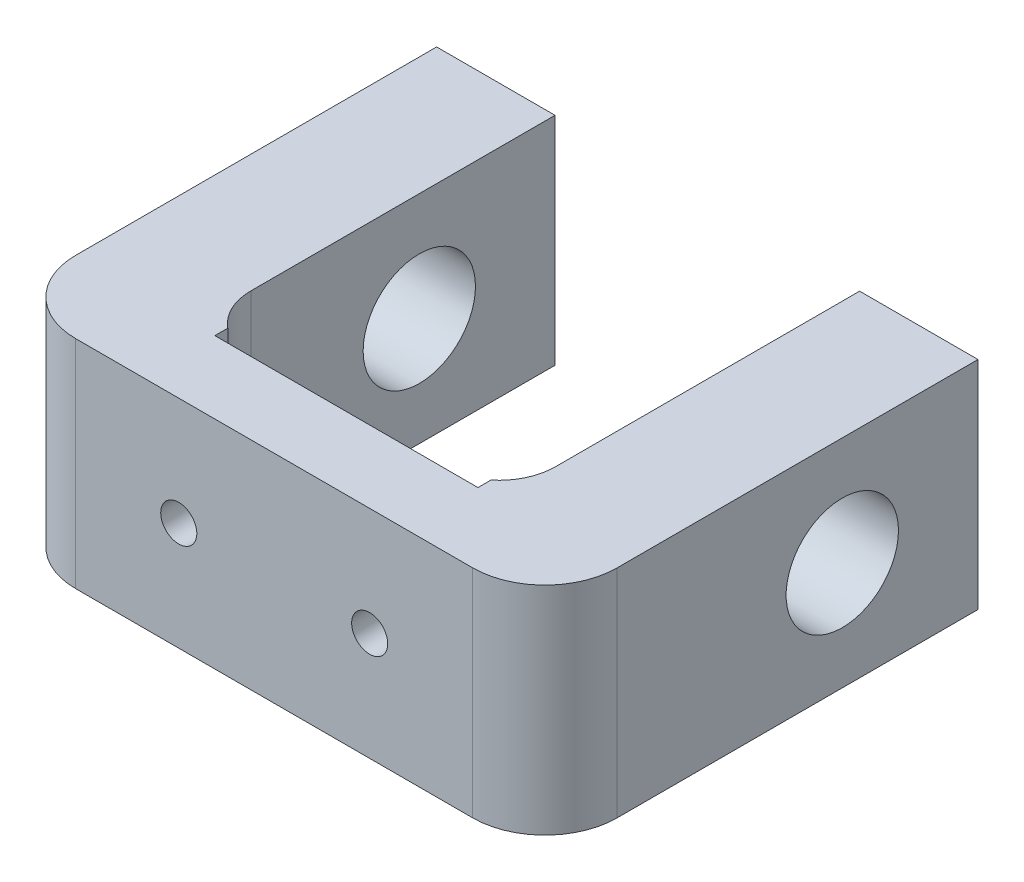
ISO-10303-21;
HEADER;
FILE_DESCRIPTION(('STEP AP214'),'2;1');
FILE_NAME('part.step','',(''),(''),'','','');
FILE_SCHEMA(('AUTOMOTIVE_DESIGN { 1 0 10303 214 1 1 1 1 }'));
ENDSEC;
DATA;
#1=APPLICATION_CONTEXT('core data for automotive mechanical design processes');
#2=APPLICATION_PROTOCOL_DEFINITION('international standard','automotive_design',2000,#1);
#3=PRODUCT_CONTEXT('',#1,'mechanical');
#4=PRODUCT('Part','Part','',(#3));
#5=PRODUCT_RELATED_PRODUCT_CATEGORY('part','',(#4));
#6=PRODUCT_DEFINITION_FORMATION('','',#4);
#7=PRODUCT_DEFINITION_CONTEXT('part definition',#1,'design');
#8=PRODUCT_DEFINITION('design','',#6,#7);
#9=PRODUCT_DEFINITION_SHAPE('','',#8);
#10=(LENGTH_UNIT() NAMED_UNIT(*) SI_UNIT(.MILLI.,.METRE.));
#11=(NAMED_UNIT(*) PLANE_ANGLE_UNIT() SI_UNIT($,.RADIAN.));
#12=(NAMED_UNIT(*) SI_UNIT($,.STERADIAN.) SOLID_ANGLE_UNIT());
#13=UNCERTAINTY_MEASURE_WITH_UNIT(LENGTH_MEASURE(1.E-05),#10,'distance_accuracy_value','');
#14=(GEOMETRIC_REPRESENTATION_CONTEXT(3) GLOBAL_UNCERTAINTY_ASSIGNED_CONTEXT((#13)) GLOBAL_UNIT_ASSIGNED_CONTEXT((#10,
#11,#12)) REPRESENTATION_CONTEXT('',''));
#15=CARTESIAN_POINT('',(0.,0.,0.));
#16=DIRECTION('',(0.,0.,1.));
#17=DIRECTION('',(1.,0.,0.));
#18=AXIS2_PLACEMENT_3D('',#15,#16,#17);
#19=CARTESIAN_POINT('',(-47.625,38.1,-76.2));
#20=DIRECTION('',(0.,0.,1.));
#21=DIRECTION('',(1.,0.,0.));
#22=AXIS2_PLACEMENT_3D('',#19,#20,#21);
#23=PLANE('',#22);
#24=DIRECTION('',(-1.,0.,0.));
#25=VECTOR('',#24,1.);
#26=CARTESIAN_POINT('',(-47.625,0.,-76.2));
#27=LINE('',#26,#25);
#28=CARTESIAN_POINT('',(-26.797,0.,-76.2));
#29=VERTEX_POINT('',#28);
#30=CARTESIAN_POINT('',(-47.625,0.,-76.2));
#31=VERTEX_POINT('',#30);
#32=EDGE_CURVE('E159',#29,#31,#27,.T.);
#33=ORIENTED_EDGE('',*,*,#32,.T.);
#34=DIRECTION('',(0.,-1.,0.));
#35=VECTOR('',#34,1.);
#36=CARTESIAN_POINT('',(-47.625,38.1,-76.2));
#37=LINE('',#36,#35);
#38=CARTESIAN_POINT('',(-47.625,38.1,-76.2));
#39=VERTEX_POINT('',#38);
#40=EDGE_CURVE('E202',#39,#31,#37,.T.);
#41=ORIENTED_EDGE('',*,*,#40,.F.);
#42=DIRECTION('',(-1.,0.,0.));
#43=VECTOR('',#42,1.);
#44=CARTESIAN_POINT('',(-47.625,38.1,-76.2));
#45=LINE('',#44,#43);
#46=CARTESIAN_POINT('',(-26.797,38.1,-76.2));
#47=VERTEX_POINT('',#46);
#48=EDGE_CURVE('E183',#47,#39,#45,.T.);
#49=ORIENTED_EDGE('',*,*,#48,.F.);
#50=DIRECTION('',(0.,-1.,0.));
#51=VECTOR('',#50,1.);
#52=CARTESIAN_POINT('',(-26.797,38.1,-76.2));
#53=LINE('',#52,#51);
#54=EDGE_CURVE('E158',#47,#29,#53,.T.);
#55=ORIENTED_EDGE('',*,*,#54,.T.);
#56=EDGE_LOOP('',(#33,#41,#49,#55));
#57=FACE_BOUND('',#56,.T.);
#58=ADVANCED_FACE('F33',(#57),#23,.F.);
#59=CARTESIAN_POINT('',(-47.625,38.1,-76.2));
#60=DIRECTION('',(1.,0.,0.));
#61=DIRECTION('',(0.,0.,-1.));
#62=AXIS2_PLACEMENT_3D('',#59,#60,#61);
#63=PLANE('',#62);
#64=CARTESIAN_POINT('',(-47.625,19.05,-52.324));
#65=DIRECTION('',(1.,0.,0.));
#66=DIRECTION('',(0.,0.,-1.));
#67=AXIS2_PLACEMENT_3D('',#64,#65,#66);
#68=CIRCLE('',#67,9.8806);
#69=CARTESIAN_POINT('',(-47.625,19.05,-62.2046));
#70=VERTEX_POINT('',#69);
#71=EDGE_CURVE('E206',#70,#70,#68,.T.);
#72=ORIENTED_EDGE('',*,*,#71,.T.);
#73=EDGE_LOOP('',(#72));
#74=FACE_BOUND('',#73,.T.);
#75=DIRECTION('',(0.,0.,1.));
#76=VECTOR('',#75,1.);
#77=CARTESIAN_POINT('',(-47.625,0.,-76.2));
#78=LINE('',#77,#76);
#79=CARTESIAN_POINT('',(-47.625,0.,-12.7));
#80=VERTEX_POINT('',#79);
#81=EDGE_CURVE('E162',#31,#80,#78,.T.);
#82=ORIENTED_EDGE('',*,*,#81,.T.);
#83=DIRECTION('',(0.,-1.,0.));
#84=VECTOR('',#83,1.);
#85=CARTESIAN_POINT('',(-47.625,38.1,-12.7));
#86=LINE('',#85,#84);
#87=CARTESIAN_POINT('',(-47.625,38.1,-12.7));
#88=VERTEX_POINT('',#87);
#89=EDGE_CURVE('E199',#88,#80,#86,.T.);
#90=ORIENTED_EDGE('',*,*,#89,.F.);
#91=DIRECTION('',(0.,0.,1.));
#92=VECTOR('',#91,1.);
#93=CARTESIAN_POINT('',(-47.625,38.1,-76.2));
#94=LINE('',#93,#92);
#95=EDGE_CURVE('E100',#39,#88,#94,.T.);
#96=ORIENTED_EDGE('',*,*,#95,.F.);
#97=ORIENTED_EDGE('',*,*,#40,.T.);
#98=EDGE_LOOP('',(#82,#90,#96,#97));
#99=FACE_BOUND('',#98,.T.);
#100=ADVANCED_FACE('F231',(#74,#99),#63,.F.);
#101=CARTESIAN_POINT('',(-34.925,38.1,-12.7));
#102=DIRECTION('',(0.,-1.,0.));
#103=DIRECTION('',(0.,0.,-1.));
#104=AXIS2_PLACEMENT_3D('',#101,#102,#103);
#105=CYLINDRICAL_SURFACE('',#104,12.7);
#106=CARTESIAN_POINT('',(-34.925,0.,-12.7));
#107=DIRECTION('',(0.,1.,0.));
#108=DIRECTION('',(0.,0.,-1.));
#109=AXIS2_PLACEMENT_3D('',#106,#107,#108);
#110=CIRCLE('',#109,12.7);
#111=CARTESIAN_POINT('',(-34.925,0.,0.));
#112=VERTEX_POINT('',#111);
#113=EDGE_CURVE('E165',#80,#112,#110,.T.);
#114=ORIENTED_EDGE('',*,*,#113,.T.);
#115=DIRECTION('',(0.,-1.,0.));
#116=VECTOR('',#115,1.);
#117=CARTESIAN_POINT('',(-34.925,38.1,0.));
#118=LINE('',#117,#116);
#119=CARTESIAN_POINT('',(-34.925,38.1,0.));
#120=VERTEX_POINT('',#119);
#121=EDGE_CURVE('E196',#120,#112,#118,.T.);
#122=ORIENTED_EDGE('',*,*,#121,.F.);
#123=CARTESIAN_POINT('',(-34.925,38.1,-12.7));
#124=DIRECTION('',(0.,1.,0.));
#125=DIRECTION('',(0.,0.,-1.));
#126=AXIS2_PLACEMENT_3D('',#123,#124,#125);
#127=CIRCLE('',#126,12.7);
#128=EDGE_CURVE('E249',#88,#120,#127,.T.);
#129=ORIENTED_EDGE('',*,*,#128,.F.);
#130=ORIENTED_EDGE('',*,*,#89,.T.);
#131=EDGE_LOOP('',(#114,#122,#129,#130));
#132=FACE_BOUND('',#131,.T.);
#133=ADVANCED_FACE('F236',(#132),#105,.T.);
#134=CARTESIAN_POINT('',(-34.925,38.1,0.));
#135=DIRECTION('',(0.,0.,-1.));
#136=DIRECTION('',(-1.,0.,0.));
#137=AXIS2_PLACEMENT_3D('',#134,#135,#136);
#138=PLANE('',#137);
#139=CARTESIAN_POINT('',(16.797,19.05,0.));
#140=DIRECTION('',(0.,0.,-1.));
#141=DIRECTION('',(-1.,0.,0.));
#142=AXIS2_PLACEMENT_3D('',#139,#140,#141);
#143=CIRCLE('',#142,3.175);
#144=CARTESIAN_POINT('',(13.622,19.05,0.));
#145=VERTEX_POINT('',#144);
#146=EDGE_CURVE('E310',#145,#145,#143,.T.);
#147=ORIENTED_EDGE('',*,*,#146,.T.);
#148=EDGE_LOOP('',(#147));
#149=FACE_BOUND('',#148,.T.);
#150=CARTESIAN_POINT('',(-16.797,19.05,0.));
#151=DIRECTION('',(0.,0.,-1.));
#152=DIRECTION('',(-1.,0.,0.));
#153=AXIS2_PLACEMENT_3D('',#150,#151,#152);
#154=CIRCLE('',#153,3.175);
#155=CARTESIAN_POINT('',(-19.972,19.05,0.));
#156=VERTEX_POINT('',#155);
#157=EDGE_CURVE('E309',#156,#156,#154,.T.);
#158=ORIENTED_EDGE('',*,*,#157,.T.);
#159=EDGE_LOOP('',(#158));
#160=FACE_BOUND('',#159,.T.);
#161=DIRECTION('',(1.,0.,0.));
#162=VECTOR('',#161,1.);
#163=CARTESIAN_POINT('',(-34.925,0.,0.));
#164=LINE('',#163,#162);
#165=CARTESIAN_POINT('',(34.925,0.,0.));
#166=VERTEX_POINT('',#165);
#167=EDGE_CURVE('E167',#112,#166,#164,.T.);
#168=ORIENTED_EDGE('',*,*,#167,.T.);
#169=DIRECTION('',(0.,-1.,0.));
#170=VECTOR('',#169,1.);
#171=CARTESIAN_POINT('',(34.925,38.1,0.));
#172=LINE('',#171,#170);
#173=CARTESIAN_POINT('',(34.925,38.1,0.));
#174=VERTEX_POINT('',#173);
#175=EDGE_CURVE('E193',#174,#166,#172,.T.);
#176=ORIENTED_EDGE('',*,*,#175,.F.);
#177=DIRECTION('',(1.,0.,0.));
#178=VECTOR('',#177,1.);
#179=CARTESIAN_POINT('',(-34.925,38.1,0.));
#180=LINE('',#179,#178);
#181=EDGE_CURVE('E251',#120,#174,#180,.T.);
#182=ORIENTED_EDGE('',*,*,#181,.F.);
#183=ORIENTED_EDGE('',*,*,#121,.T.);
#184=EDGE_LOOP('',(#168,#176,#182,#183));
#185=FACE_BOUND('',#184,.T.);
#186=ADVANCED_FACE('F361',(#149,#160,#185),#138,.F.);
#187=CARTESIAN_POINT('',(34.925,38.1,-12.7));
#188=DIRECTION('',(0.,-1.,0.));
#189=DIRECTION('',(0.,0.,-1.));
#190=AXIS2_PLACEMENT_3D('',#187,#188,#189);
#191=CYLINDRICAL_SURFACE('',#190,12.7);
#192=CARTESIAN_POINT('',(34.925,0.,-12.7));
#193=DIRECTION('',(0.,1.,0.));
#194=DIRECTION('',(0.,0.,1.));
#195=AXIS2_PLACEMENT_3D('',#192,#193,#194);
#196=CIRCLE('',#195,12.7);
#197=CARTESIAN_POINT('',(47.625,0.,-12.7));
#198=VERTEX_POINT('',#197);
#199=EDGE_CURVE('E169',#166,#198,#196,.T.);
#200=ORIENTED_EDGE('',*,*,#199,.T.);
#201=DIRECTION('',(0.,-1.,0.));
#202=VECTOR('',#201,1.);
#203=CARTESIAN_POINT('',(47.625,38.1,-12.7));
#204=LINE('',#203,#202);
#205=CARTESIAN_POINT('',(47.625,38.1,-12.7));
#206=VERTEX_POINT('',#205);
#207=EDGE_CURVE('E190',#206,#198,#204,.T.);
#208=ORIENTED_EDGE('',*,*,#207,.F.);
#209=CARTESIAN_POINT('',(34.925,38.1,-12.7));
#210=DIRECTION('',(0.,1.,0.));
#211=DIRECTION('',(0.,0.,1.));
#212=AXIS2_PLACEMENT_3D('',#209,#210,#211);
#213=CIRCLE('',#212,12.7);
#214=EDGE_CURVE('E253',#174,#206,#213,.T.);
#215=ORIENTED_EDGE('',*,*,#214,.F.);
#216=ORIENTED_EDGE('',*,*,#175,.T.);
#217=EDGE_LOOP('',(#200,#208,#215,#216));
#218=FACE_BOUND('',#217,.T.);
#219=ADVANCED_FACE('F357',(#218),#191,.T.);
#220=CARTESIAN_POINT('',(47.625,38.1,-12.7));
#221=DIRECTION('',(-1.,0.,0.));
#222=DIRECTION('',(0.,0.,1.));
#223=AXIS2_PLACEMENT_3D('',#220,#221,#222);
#224=PLANE('',#223);
#225=CARTESIAN_POINT('',(47.625,19.05,-52.324));
#226=DIRECTION('',(1.,0.,0.));
#227=DIRECTION('',(0.,0.,-1.));
#228=AXIS2_PLACEMENT_3D('',#225,#226,#227);
#229=CIRCLE('',#228,9.8806);
#230=CARTESIAN_POINT('',(47.625,19.05,-62.2046));
#231=VERTEX_POINT('',#230);
#232=EDGE_CURVE('E318',#231,#231,#229,.T.);
#233=ORIENTED_EDGE('',*,*,#232,.F.);
#234=EDGE_LOOP('',(#233));
#235=FACE_BOUND('',#234,.T.);
#236=DIRECTION('',(0.,0.,-1.));
#237=VECTOR('',#236,1.);
#238=CARTESIAN_POINT('',(47.625,0.,-12.7));
#239=LINE('',#238,#237);
#240=CARTESIAN_POINT('',(47.625,0.,-76.2));
#241=VERTEX_POINT('',#240);
#242=EDGE_CURVE('E171',#198,#241,#239,.T.);
#243=ORIENTED_EDGE('',*,*,#242,.T.);
#244=DIRECTION('',(0.,-1.,0.));
#245=VECTOR('',#244,1.);
#246=CARTESIAN_POINT('',(47.625,38.1,-76.2));
#247=LINE('',#246,#245);
#248=CARTESIAN_POINT('',(47.625,38.1,-76.2));
#249=VERTEX_POINT('',#248);
#250=EDGE_CURVE('E187',#249,#241,#247,.T.);
#251=ORIENTED_EDGE('',*,*,#250,.F.);
#252=DIRECTION('',(0.,0.,-1.));
#253=VECTOR('',#252,1.);
#254=CARTESIAN_POINT('',(47.625,38.1,-12.7));
#255=LINE('',#254,#253);
#256=EDGE_CURVE('E259',#206,#249,#255,.T.);
#257=ORIENTED_EDGE('',*,*,#256,.F.);
#258=ORIENTED_EDGE('',*,*,#207,.T.);
#259=EDGE_LOOP('',(#243,#251,#257,#258));
#260=FACE_BOUND('',#259,.T.);
#261=ADVANCED_FACE('F265',(#235,#260),#224,.F.);
#262=CARTESIAN_POINT('',(47.625,38.1,-76.2));
#263=DIRECTION('',(0.,0.,1.));
#264=DIRECTION('',(1.,0.,0.));
#265=AXIS2_PLACEMENT_3D('',#262,#263,#264);
#266=PLANE('',#265);
#267=DIRECTION('',(-1.,0.,0.));
#268=VECTOR('',#267,1.);
#269=CARTESIAN_POINT('',(47.625,0.,-76.2));
#270=LINE('',#269,#268);
#271=CARTESIAN_POINT('',(26.797,0.,-76.2));
#272=VERTEX_POINT('',#271);
#273=EDGE_CURVE('E173',#241,#272,#270,.T.);
#274=ORIENTED_EDGE('',*,*,#273,.T.);
#275=DIRECTION('',(0.,-1.,0.));
#276=VECTOR('',#275,1.);
#277=CARTESIAN_POINT('',(26.797,38.1,-76.2));
#278=LINE('',#277,#276);
#279=CARTESIAN_POINT('',(26.797,38.1,-76.2));
#280=VERTEX_POINT('',#279);
#281=EDGE_CURVE('E142',#280,#272,#278,.T.);
#282=ORIENTED_EDGE('',*,*,#281,.F.);
#283=DIRECTION('',(-1.,0.,0.));
#284=VECTOR('',#283,1.);
#285=CARTESIAN_POINT('',(47.625,38.1,-76.2));
#286=LINE('',#285,#284);
#287=EDGE_CURVE('E129',#249,#280,#286,.T.);
#288=ORIENTED_EDGE('',*,*,#287,.F.);
#289=ORIENTED_EDGE('',*,*,#250,.T.);
#290=EDGE_LOOP('',(#274,#282,#288,#289));
#291=FACE_BOUND('',#290,.T.);
#292=ADVANCED_FACE('F269',(#291),#266,.F.);
#293=CARTESIAN_POINT('',(26.797,38.1,-76.2));
#294=DIRECTION('',(1.,0.,0.));
#295=DIRECTION('',(0.,0.,-1.));
#296=AXIS2_PLACEMENT_3D('',#293,#294,#295);
#297=PLANE('',#296);
#298=CARTESIAN_POINT('',(26.797,19.05,-52.324));
#299=DIRECTION('',(1.,0.,0.));
#300=DIRECTION('',(0.,0.,-1.));
#301=AXIS2_PLACEMENT_3D('',#298,#299,#300);
#302=CIRCLE('',#301,9.8806);
#303=CARTESIAN_POINT('',(26.797,19.05,-62.2046));
#304=VERTEX_POINT('',#303);
#305=EDGE_CURVE('E163',#304,#304,#302,.T.);
#306=ORIENTED_EDGE('',*,*,#305,.T.);
#307=EDGE_LOOP('',(#306));
#308=FACE_BOUND('',#307,.T.);
#309=DIRECTION('',(0.,0.,1.));
#310=VECTOR('',#309,1.);
#311=CARTESIAN_POINT('',(26.797,0.,-76.2));
#312=LINE('',#311,#310);
#313=CARTESIAN_POINT('',(26.797,0.,-22.7));
#314=VERTEX_POINT('',#313);
#315=EDGE_CURVE('E138',#272,#314,#312,.T.);
#316=ORIENTED_EDGE('',*,*,#315,.T.);
#317=DIRECTION('',(0.,-1.,0.));
#318=VECTOR('',#317,1.);
#319=CARTESIAN_POINT('',(26.797,38.1,-22.7));
#320=LINE('',#319,#318);
#321=CARTESIAN_POINT('',(26.797,38.1,-22.7));
#322=VERTEX_POINT('',#321);
#323=EDGE_CURVE('E135',#322,#314,#320,.T.);
#324=ORIENTED_EDGE('',*,*,#323,.F.);
#325=DIRECTION('',(0.,0.,1.));
#326=VECTOR('',#325,1.);
#327=CARTESIAN_POINT('',(26.797,38.1,-76.2));
#328=LINE('',#327,#326);
#329=EDGE_CURVE('E122',#280,#322,#328,.T.);
#330=ORIENTED_EDGE('',*,*,#329,.F.);
#331=ORIENTED_EDGE('',*,*,#281,.T.);
#332=EDGE_LOOP('',(#316,#324,#330,#331));
#333=FACE_BOUND('',#332,.T.);
#334=ADVANCED_FACE('F136',(#308,#333),#297,.F.);
#335=CARTESIAN_POINT('',(16.797,38.1,-22.7));
#336=DIRECTION('',(0.,-1.,0.));
#337=DIRECTION('',(0.,0.,-1.));
#338=AXIS2_PLACEMENT_3D('',#335,#336,#337);
#339=CYLINDRICAL_SURFACE('',#338,10.);
#340=CARTESIAN_POINT('',(16.797,0.,-22.7));
#341=DIRECTION('',(0.,-1.,0.));
#342=DIRECTION('',(0.,0.,1.));
#343=AXIS2_PLACEMENT_3D('',#340,#341,#342);
#344=CIRCLE('',#343,10.);
#345=CARTESIAN_POINT('',(23.147,0.,-14.97487864173));
#346=VERTEX_POINT('',#345);
#347=EDGE_CURVE('E176',#314,#346,#344,.T.);
#348=ORIENTED_EDGE('',*,*,#347,.T.);
#349=DIRECTION('',(0.,-1.,0.));
#350=VECTOR('',#349,1.);
#351=CARTESIAN_POINT('',(23.147,38.1,-14.97487864173));
#352=LINE('',#351,#350);
#353=CARTESIAN_POINT('',(23.147,38.1,-14.97487864173));
#354=VERTEX_POINT('',#353);
#355=EDGE_CURVE('E148',#346,#354,#352,.F.);
#356=ORIENTED_EDGE('',*,*,#355,.T.);
#357=CARTESIAN_POINT('',(16.797,38.1,-22.7));
#358=DIRECTION('',(0.,-1.,0.));
#359=DIRECTION('',(0.,0.,1.));
#360=AXIS2_PLACEMENT_3D('',#357,#358,#359);
#361=CIRCLE('',#360,10.);
#362=EDGE_CURVE('E127',#322,#354,#361,.T.);
#363=ORIENTED_EDGE('',*,*,#362,.F.);
#364=ORIENTED_EDGE('',*,*,#323,.T.);
#365=EDGE_LOOP('',(#348,#356,#363,#364));
#366=FACE_BOUND('',#365,.T.);
#367=ADVANCED_FACE('F146',(#366),#339,.F.);
#368=CARTESIAN_POINT('',(-16.797,38.1,-12.7));
#369=DIRECTION('',(0.,0.,1.));
#370=DIRECTION('',(1.,0.,0.));
#371=AXIS2_PLACEMENT_3D('',#368,#369,#370);
#372=PLANE('',#371);
#373=DIRECTION('',(0.,-1.,0.));
#374=VECTOR('',#373,1.);
#375=CARTESIAN_POINT('',(23.147,38.1,-12.7));
#376=LINE('',#375,#374);
#377=CARTESIAN_POINT('',(23.147,38.1,-12.7));
#378=VERTEX_POINT('',#377);
#379=CARTESIAN_POINT('',(23.147,0.,-12.7));
#380=VERTEX_POINT('',#379);
#381=EDGE_CURVE('E292',#378,#380,#376,.T.);
#382=ORIENTED_EDGE('',*,*,#381,.T.);
#383=DIRECTION('',(-1.,0.,0.));
#384=VECTOR('',#383,1.);
#385=CARTESIAN_POINT('',(-16.797,0.,-12.7));
#386=LINE('',#385,#384);
#387=CARTESIAN_POINT('',(-23.147,0.,-12.7));
#388=VERTEX_POINT('',#387);
#389=EDGE_CURVE('E178',#380,#388,#386,.T.);
#390=ORIENTED_EDGE('',*,*,#389,.T.);
#391=DIRECTION('',(0.,-1.,0.));
#392=VECTOR('',#391,1.);
#393=CARTESIAN_POINT('',(-23.147,38.1,-12.7));
#394=LINE('',#393,#392);
#395=CARTESIAN_POINT('',(-23.147,38.1,-12.7));
#396=VERTEX_POINT('',#395);
#397=EDGE_CURVE('E294',#396,#388,#394,.T.);
#398=ORIENTED_EDGE('',*,*,#397,.F.);
#399=DIRECTION('',(-1.,0.,0.));
#400=VECTOR('',#399,1.);
#401=CARTESIAN_POINT('',(-16.797,38.1,-12.7));
#402=LINE('',#401,#400);
#403=EDGE_CURVE('E149',#378,#396,#402,.T.);
#404=ORIENTED_EDGE('',*,*,#403,.F.);
#405=EDGE_LOOP('',(#382,#390,#398,#404));
#406=FACE_BOUND('',#405,.T.);
#407=CARTESIAN_POINT('',(16.797,19.05,-12.7));
#408=DIRECTION('',(0.,0.,1.));
#409=DIRECTION('',(1.,0.,0.));
#410=AXIS2_PLACEMENT_3D('',#407,#408,#409);
#411=CIRCLE('',#410,3.175);
#412=CARTESIAN_POINT('',(13.622,19.05,-12.7));
#413=VERTEX_POINT('',#412);
#414=EDGE_CURVE('E41',#413,#413,#411,.T.);
#415=ORIENTED_EDGE('',*,*,#414,.T.);
#416=EDGE_LOOP('',(#415));
#417=FACE_BOUND('',#416,.T.);
#418=CARTESIAN_POINT('',(-16.797,19.05,-12.7));
#419=DIRECTION('',(0.,0.,1.));
#420=DIRECTION('',(1.,0.,0.));
#421=AXIS2_PLACEMENT_3D('',#418,#419,#420);
#422=CIRCLE('',#421,3.175);
#423=CARTESIAN_POINT('',(-19.972,19.05,-12.7));
#424=VERTEX_POINT('',#423);
#425=EDGE_CURVE('E313',#424,#424,#422,.T.);
#426=ORIENTED_EDGE('',*,*,#425,.T.);
#427=EDGE_LOOP('',(#426));
#428=FACE_BOUND('',#427,.T.);
#429=ADVANCED_FACE('F210',(#406,#417,#428),#372,.F.);
#430=CARTESIAN_POINT('',(-16.797,38.1,-22.7));
#431=DIRECTION('',(0.,-1.,0.));
#432=DIRECTION('',(0.,0.,-1.));
#433=AXIS2_PLACEMENT_3D('',#430,#431,#432);
#434=CYLINDRICAL_SURFACE('',#433,10.);
#435=CARTESIAN_POINT('',(-16.797,38.1,-22.7));
#436=DIRECTION('',(0.,-1.,0.));
#437=DIRECTION('',(0.,0.,-1.));
#438=AXIS2_PLACEMENT_3D('',#435,#436,#437);
#439=CIRCLE('',#438,10.);
#440=CARTESIAN_POINT('',(-23.147,38.1,-14.97487864173));
#441=VERTEX_POINT('',#440);
#442=CARTESIAN_POINT('',(-26.797,38.1,-22.7));
#443=VERTEX_POINT('',#442);
#444=EDGE_CURVE('E152',#441,#443,#439,.T.);
#445=ORIENTED_EDGE('',*,*,#444,.F.);
#446=DIRECTION('',(0.,-1.,0.));
#447=VECTOR('',#446,1.);
#448=CARTESIAN_POINT('',(-23.147,38.1,-14.97487864173));
#449=LINE('',#448,#447);
#450=CARTESIAN_POINT('',(-23.147,0.,-14.97487864173));
#451=VERTEX_POINT('',#450);
#452=EDGE_CURVE('E305',#441,#451,#449,.T.);
#453=ORIENTED_EDGE('',*,*,#452,.T.);
#454=CARTESIAN_POINT('',(-16.797,0.,-22.7));
#455=DIRECTION('',(0.,-1.,0.));
#456=DIRECTION('',(0.,0.,-1.));
#457=AXIS2_PLACEMENT_3D('',#454,#455,#456);
#458=CIRCLE('',#457,10.);
#459=CARTESIAN_POINT('',(-26.797,0.,-22.7));
#460=VERTEX_POINT('',#459);
#461=EDGE_CURVE('E85',#451,#460,#458,.T.);
#462=ORIENTED_EDGE('',*,*,#461,.T.);
#463=DIRECTION('',(0.,-1.,0.));
#464=VECTOR('',#463,1.);
#465=CARTESIAN_POINT('',(-26.797,38.1,-22.7));
#466=LINE('',#465,#464);
#467=EDGE_CURVE('E143',#443,#460,#466,.T.);
#468=ORIENTED_EDGE('',*,*,#467,.F.);
#469=EDGE_LOOP('',(#445,#453,#462,#468));
#470=FACE_BOUND('',#469,.T.);
#471=ADVANCED_FACE('F343',(#470),#434,.F.);
#472=CARTESIAN_POINT('',(-26.797,38.1,-76.2));
#473=DIRECTION('',(-1.,0.,0.));
#474=DIRECTION('',(0.,0.,1.));
#475=AXIS2_PLACEMENT_3D('',#472,#473,#474);
#476=PLANE('',#475);
#477=CARTESIAN_POINT('',(-26.797,19.05,-52.324));
#478=DIRECTION('',(-1.,0.,0.));
#479=DIRECTION('',(0.,0.,1.));
#480=AXIS2_PLACEMENT_3D('',#477,#478,#479);
#481=CIRCLE('',#480,9.8806);
#482=CARTESIAN_POINT('',(-26.797,19.05,-42.4434));
#483=VERTEX_POINT('',#482);
#484=EDGE_CURVE('E204',#483,#483,#481,.T.);
#485=ORIENTED_EDGE('',*,*,#484,.T.);
#486=EDGE_LOOP('',(#485));
#487=FACE_BOUND('',#486,.T.);
#488=DIRECTION('',(0.,0.,-1.));
#489=VECTOR('',#488,1.);
#490=CARTESIAN_POINT('',(-26.797,0.,-76.2));
#491=LINE('',#490,#489);
#492=EDGE_CURVE('E91',#460,#29,#491,.T.);
#493=ORIENTED_EDGE('',*,*,#492,.T.);
#494=ORIENTED_EDGE('',*,*,#54,.F.);
#495=DIRECTION('',(0.,0.,-1.));
#496=VECTOR('',#495,1.);
#497=CARTESIAN_POINT('',(-26.797,38.1,-76.2));
#498=LINE('',#497,#496);
#499=EDGE_CURVE('E49',#443,#47,#498,.T.);
#500=ORIENTED_EDGE('',*,*,#499,.F.);
#501=ORIENTED_EDGE('',*,*,#467,.T.);
#502=EDGE_LOOP('',(#493,#494,#500,#501));
#503=FACE_BOUND('',#502,.T.);
#504=ADVANCED_FACE('F338',(#487,#503),#476,.F.);
#505=CARTESIAN_POINT('',(-16.797,38.1,-22.7));
#506=DIRECTION('',(0.,-1.,0.));
#507=DIRECTION('',(0.,0.,-1.));
#508=AXIS2_PLACEMENT_3D('',#505,#506,#507);
#509=PLANE('',#508);
#510=ORIENTED_EDGE('',*,*,#362,.T.);
#511=DIRECTION('',(0.,0.,1.));
#512=VECTOR('',#511,1.);
#513=CARTESIAN_POINT('',(23.147,38.1,-15.24));
#514=LINE('',#513,#512);
#515=EDGE_CURVE('E297',#354,#378,#514,.T.);
#516=ORIENTED_EDGE('',*,*,#515,.T.);
#517=ORIENTED_EDGE('',*,*,#403,.T.);
#518=DIRECTION('',(0.,0.,-1.));
#519=VECTOR('',#518,1.);
#520=CARTESIAN_POINT('',(-23.147,38.1,-15.24));
#521=LINE('',#520,#519);
#522=EDGE_CURVE('E298',#396,#441,#521,.T.);
#523=ORIENTED_EDGE('',*,*,#522,.T.);
#524=ORIENTED_EDGE('',*,*,#444,.T.);
#525=ORIENTED_EDGE('',*,*,#499,.T.);
#526=ORIENTED_EDGE('',*,*,#48,.T.);
#527=ORIENTED_EDGE('',*,*,#95,.T.);
#528=ORIENTED_EDGE('',*,*,#128,.T.);
#529=ORIENTED_EDGE('',*,*,#181,.T.);
#530=ORIENTED_EDGE('',*,*,#214,.T.);
#531=ORIENTED_EDGE('',*,*,#256,.T.);
#532=ORIENTED_EDGE('',*,*,#287,.T.);
#533=ORIENTED_EDGE('',*,*,#329,.T.);
#534=EDGE_LOOP('',(#510,#516,#517,#523,#524,#525,#526,#527,#528,#529,#530,#531,#532,#533));
#535=FACE_BOUND('',#534,.T.);
#536=ADVANCED_FACE('F124',(#535),#509,.F.);
#537=CARTESIAN_POINT('',(-16.797,0.,-22.7));
#538=DIRECTION('',(0.,-1.,0.));
#539=DIRECTION('',(0.,0.,-1.));
#540=AXIS2_PLACEMENT_3D('',#537,#538,#539);
#541=PLANE('',#540);
#542=DIRECTION('',(0.,0.,1.));
#543=VECTOR('',#542,1.);
#544=CARTESIAN_POINT('',(23.147,0.,-22.7));
#545=LINE('',#544,#543);
#546=EDGE_CURVE('E11',#346,#380,#545,.T.);
#547=ORIENTED_EDGE('',*,*,#546,.F.);
#548=ORIENTED_EDGE('',*,*,#347,.F.);
#549=ORIENTED_EDGE('',*,*,#315,.F.);
#550=ORIENTED_EDGE('',*,*,#273,.F.);
#551=ORIENTED_EDGE('',*,*,#242,.F.);
#552=ORIENTED_EDGE('',*,*,#199,.F.);
#553=ORIENTED_EDGE('',*,*,#167,.F.);
#554=ORIENTED_EDGE('',*,*,#113,.F.);
#555=ORIENTED_EDGE('',*,*,#81,.F.);
#556=ORIENTED_EDGE('',*,*,#32,.F.);
#557=ORIENTED_EDGE('',*,*,#492,.F.);
#558=ORIENTED_EDGE('',*,*,#461,.F.);
#559=DIRECTION('',(0.,0.,-1.));
#560=VECTOR('',#559,1.);
#561=CARTESIAN_POINT('',(-23.147,0.,-15.24));
#562=LINE('',#561,#560);
#563=EDGE_CURVE('E300',#388,#451,#562,.T.);
#564=ORIENTED_EDGE('',*,*,#563,.F.);
#565=ORIENTED_EDGE('',*,*,#389,.F.);
#566=EDGE_LOOP('',(#547,#548,#549,#550,#551,#552,#553,#554,#555,#556,#557,#558,#564,#565));
#567=FACE_BOUND('',#566,.T.);
#568=ADVANCED_FACE('F243',(#567),#541,.T.);
#569=CARTESIAN_POINT('',(-47.625,19.05,-52.324));
#570=DIRECTION('',(1.,0.,0.));
#571=DIRECTION('',(0.,0.,-1.));
#572=AXIS2_PLACEMENT_3D('',#569,#570,#571);
#573=CYLINDRICAL_SURFACE('',#572,9.8806);
#574=ORIENTED_EDGE('',*,*,#71,.F.);
#575=EDGE_LOOP('',(#574));
#576=FACE_BOUND('',#575,.T.);
#577=ORIENTED_EDGE('',*,*,#484,.F.);
#578=EDGE_LOOP('',(#577));
#579=FACE_BOUND('',#578,.T.);
#580=ADVANCED_FACE('F328',(#576,#579),#573,.F.);
#581=ORIENTED_EDGE('',*,*,#232,.T.);
#582=EDGE_LOOP('',(#581));
#583=FACE_BOUND('',#582,.T.);
#584=ORIENTED_EDGE('',*,*,#305,.F.);
#585=EDGE_LOOP('',(#584));
#586=FACE_BOUND('',#585,.T.);
#587=ADVANCED_FACE('F226',(#583,#586),#573,.F.);
#588=CARTESIAN_POINT('',(-16.797,19.05,0.));
#589=DIRECTION('',(0.,0.,-1.));
#590=DIRECTION('',(-1.,0.,0.));
#591=AXIS2_PLACEMENT_3D('',#588,#589,#590);
#592=CYLINDRICAL_SURFACE('',#591,3.175);
#593=CARTESIAN_POINT('',(-19.972,19.05,0.));
#594=CARTESIAN_POINT('',(-19.972,19.05,-0.132291666666665));
#595=CARTESIAN_POINT('',(-19.972,19.05,-0.264583333333332));
#596=CARTESIAN_POINT('',(-19.972,19.05,-0.529166666666665));
#597=CARTESIAN_POINT('',(-19.972,19.05,-0.661458333333332));
#598=CARTESIAN_POINT('',(-19.972,19.05,-0.926041666666665));
#599=CARTESIAN_POINT('',(-19.972,19.05,-1.05833333333333));
#600=CARTESIAN_POINT('',(-19.972,19.05,-1.32291666666666));
#601=CARTESIAN_POINT('',(-19.972,19.05,-1.45520833333333));
#602=CARTESIAN_POINT('',(-19.972,19.05,-1.71979166666667));
#603=CARTESIAN_POINT('',(-19.972,19.05,-1.85208333333333));
#604=CARTESIAN_POINT('',(-19.972,19.05,-2.11666666666666));
#605=CARTESIAN_POINT('',(-19.972,19.05,-2.24895833333333));
#606=CARTESIAN_POINT('',(-19.972,19.05,-2.51354166666667));
#607=CARTESIAN_POINT('',(-19.972,19.05,-2.64583333333333));
#608=CARTESIAN_POINT('',(-19.972,19.05,-2.91041666666667));
#609=CARTESIAN_POINT('',(-19.972,19.05,-3.04270833333333));
#610=CARTESIAN_POINT('',(-19.972,19.05,-3.30729166666667));
#611=CARTESIAN_POINT('',(-19.972,19.05,-3.43958333333333));
#612=CARTESIAN_POINT('',(-19.972,19.05,-3.70416666666667));
#613=CARTESIAN_POINT('',(-19.972,19.05,-3.83645833333333));
#614=CARTESIAN_POINT('',(-19.972,19.05,-4.10104166666667));
#615=CARTESIAN_POINT('',(-19.972,19.05,-4.23333333333333));
#616=CARTESIAN_POINT('',(-19.972,19.05,-4.49791666666667));
#617=CARTESIAN_POINT('',(-19.972,19.05,-4.63020833333333));
#618=CARTESIAN_POINT('',(-19.972,19.05,-4.89479166666667));
#619=CARTESIAN_POINT('',(-19.972,19.05,-5.02708333333333));
#620=CARTESIAN_POINT('',(-19.972,19.05,-5.29166666666667));
#621=CARTESIAN_POINT('',(-19.972,19.05,-5.42395833333333));
#622=CARTESIAN_POINT('',(-19.972,19.05,-5.68854166666667));
#623=CARTESIAN_POINT('',(-19.972,19.05,-5.82083333333333));
#624=CARTESIAN_POINT('',(-19.972,19.05,-6.08541666666667));
#625=CARTESIAN_POINT('',(-19.972,19.05,-6.21770833333333));
#626=CARTESIAN_POINT('',(-19.972,19.05,-6.48229166666667));
#627=CARTESIAN_POINT('',(-19.972,19.05,-6.61458333333333));
#628=CARTESIAN_POINT('',(-19.972,19.05,-6.87916666666667));
#629=CARTESIAN_POINT('',(-19.972,19.05,-7.01145833333333));
#630=CARTESIAN_POINT('',(-19.972,19.05,-7.27604166666667));
#631=CARTESIAN_POINT('',(-19.972,19.05,-7.40833333333333));
#632=CARTESIAN_POINT('',(-19.972,19.05,-7.67291666666667));
#633=CARTESIAN_POINT('',(-19.972,19.05,-7.80520833333333));
#634=CARTESIAN_POINT('',(-19.972,19.05,-8.06979166666666));
#635=CARTESIAN_POINT('',(-19.972,19.05,-8.20208333333333));
#636=CARTESIAN_POINT('',(-19.972,19.05,-8.46666666666667));
#637=CARTESIAN_POINT('',(-19.972,19.05,-8.59895833333333));
#638=CARTESIAN_POINT('',(-19.972,19.05,-8.86354166666666));
#639=CARTESIAN_POINT('',(-19.972,19.05,-8.99583333333333));
#640=CARTESIAN_POINT('',(-19.972,19.05,-9.26041666666666));
#641=CARTESIAN_POINT('',(-19.972,19.05,-9.39270833333333));
#642=CARTESIAN_POINT('',(-19.972,19.05,-9.65729166666666));
#643=CARTESIAN_POINT('',(-19.972,19.05,-9.78958333333333));
#644=CARTESIAN_POINT('',(-19.972,19.05,-10.0541666666667));
#645=CARTESIAN_POINT('',(-19.972,19.05,-10.1864583333333));
#646=CARTESIAN_POINT('',(-19.972,19.05,-10.4510416666667));
#647=CARTESIAN_POINT('',(-19.972,19.05,-10.5833333333333));
#648=CARTESIAN_POINT('',(-19.972,19.05,-10.8479166666667));
#649=CARTESIAN_POINT('',(-19.972,19.05,-10.9802083333333));
#650=CARTESIAN_POINT('',(-19.972,19.05,-11.2447916666667));
#651=CARTESIAN_POINT('',(-19.972,19.05,-11.3770833333333));
#652=CARTESIAN_POINT('',(-19.972,19.05,-11.6416666666667));
#653=CARTESIAN_POINT('',(-19.972,19.05,-11.7739583333333));
#654=CARTESIAN_POINT('',(-19.972,19.05,-12.0385416666667));
#655=CARTESIAN_POINT('',(-19.972,19.05,-12.1708333333333));
#656=CARTESIAN_POINT('',(-19.972,19.05,-12.4354166666667));
#657=CARTESIAN_POINT('',(-19.972,19.05,-12.5677083333333));
#658=CARTESIAN_POINT('',(-19.972,19.05,-12.7));
#659=B_SPLINE_CURVE_WITH_KNOTS('',3,(#593,#594,#595,#596,#597,#598,#599,#600,#601,#602,#603,
#604,#605,#606,#607,#608,#609,#610,#611,#612,#613,#614,#615,#616,#617,#618,#619,#620,#621,#622,
#623,#624,#625,#626,#627,#628,#629,#630,#631,#632,#633,#634,#635,#636,#637,#638,#639,#640,#641,
#642,#643,#644,#645,#646,#647,#648,#649,#650,#651,#652,#653,#654,#655,#656,#657,#658),
.UNSPECIFIED.,.F.,.F.,(4,2,2,2,2,2,2,2,2,2,2,2,2,2,2,2,2,2,2,2,2,2,2,2,2,2,2,2,2,2,2,2,4),(0.,
0.396875,0.79375,1.190625,1.5875,1.984375,2.38125,2.778125,3.175,3.571875,3.96875,4.365625,
4.7625,5.159375,5.55625,5.953125,6.35,6.746875,7.14375,7.540625,7.9375,8.334375,8.73125,
9.128125,9.525,9.921875,10.31875,10.715625,11.1125,11.509375,11.90625,12.303125,12.7),.UNSPECIFIED.);
#660=EDGE_CURVE('BSEAM216',#156,#424,#659,.T.);
#661=ORIENTED_EDGE('',*,*,#157,.F.);
#662=ORIENTED_EDGE('',*,*,#425,.F.);
#663=ORIENTED_EDGE('',*,*,#660,.T.);
#664=ORIENTED_EDGE('',*,*,#660,.F.);
#665=EDGE_LOOP('',(#661,#663,#662,#664));
#666=FACE_BOUND('',#665,.T.);
#667=ADVANCED_FACE('F216',(#666),#592,.F.);
#668=CARTESIAN_POINT('',(16.797,19.05,0.));
#669=DIRECTION('',(0.,0.,-1.));
#670=DIRECTION('',(-1.,0.,0.));
#671=AXIS2_PLACEMENT_3D('',#668,#669,#670);
#672=CYLINDRICAL_SURFACE('',#671,3.175);
#673=CARTESIAN_POINT('',(13.622,19.05,0.));
#674=CARTESIAN_POINT('',(13.622,19.05,-0.132291666666665));
#675=CARTESIAN_POINT('',(13.622,19.05,-0.264583333333332));
#676=CARTESIAN_POINT('',(13.622,19.05,-0.529166666666665));
#677=CARTESIAN_POINT('',(13.622,19.05,-0.661458333333332));
#678=CARTESIAN_POINT('',(13.622,19.05,-0.926041666666665));
#679=CARTESIAN_POINT('',(13.622,19.05,-1.05833333333333));
#680=CARTESIAN_POINT('',(13.622,19.05,-1.32291666666666));
#681=CARTESIAN_POINT('',(13.622,19.05,-1.45520833333333));
#682=CARTESIAN_POINT('',(13.622,19.05,-1.71979166666667));
#683=CARTESIAN_POINT('',(13.622,19.05,-1.85208333333333));
#684=CARTESIAN_POINT('',(13.622,19.05,-2.11666666666666));
#685=CARTESIAN_POINT('',(13.622,19.05,-2.24895833333333));
#686=CARTESIAN_POINT('',(13.622,19.05,-2.51354166666667));
#687=CARTESIAN_POINT('',(13.622,19.05,-2.64583333333333));
#688=CARTESIAN_POINT('',(13.622,19.05,-2.91041666666667));
#689=CARTESIAN_POINT('',(13.622,19.05,-3.04270833333333));
#690=CARTESIAN_POINT('',(13.622,19.05,-3.30729166666667));
#691=CARTESIAN_POINT('',(13.622,19.05,-3.43958333333333));
#692=CARTESIAN_POINT('',(13.622,19.05,-3.70416666666667));
#693=CARTESIAN_POINT('',(13.622,19.05,-3.83645833333333));
#694=CARTESIAN_POINT('',(13.622,19.05,-4.10104166666667));
#695=CARTESIAN_POINT('',(13.622,19.05,-4.23333333333333));
#696=CARTESIAN_POINT('',(13.622,19.05,-4.49791666666667));
#697=CARTESIAN_POINT('',(13.622,19.05,-4.63020833333333));
#698=CARTESIAN_POINT('',(13.622,19.05,-4.89479166666667));
#699=CARTESIAN_POINT('',(13.622,19.05,-5.02708333333333));
#700=CARTESIAN_POINT('',(13.622,19.05,-5.29166666666667));
#701=CARTESIAN_POINT('',(13.622,19.05,-5.42395833333333));
#702=CARTESIAN_POINT('',(13.622,19.05,-5.68854166666667));
#703=CARTESIAN_POINT('',(13.622,19.05,-5.82083333333333));
#704=CARTESIAN_POINT('',(13.622,19.05,-6.08541666666667));
#705=CARTESIAN_POINT('',(13.622,19.05,-6.21770833333333));
#706=CARTESIAN_POINT('',(13.622,19.05,-6.48229166666667));
#707=CARTESIAN_POINT('',(13.622,19.05,-6.61458333333333));
#708=CARTESIAN_POINT('',(13.622,19.05,-6.87916666666667));
#709=CARTESIAN_POINT('',(13.622,19.05,-7.01145833333333));
#710=CARTESIAN_POINT('',(13.622,19.05,-7.27604166666667));
#711=CARTESIAN_POINT('',(13.622,19.05,-7.40833333333333));
#712=CARTESIAN_POINT('',(13.622,19.05,-7.67291666666667));
#713=CARTESIAN_POINT('',(13.622,19.05,-7.80520833333333));
#714=CARTESIAN_POINT('',(13.622,19.05,-8.06979166666666));
#715=CARTESIAN_POINT('',(13.622,19.05,-8.20208333333333));
#716=CARTESIAN_POINT('',(13.622,19.05,-8.46666666666667));
#717=CARTESIAN_POINT('',(13.622,19.05,-8.59895833333333));
#718=CARTESIAN_POINT('',(13.622,19.05,-8.86354166666666));
#719=CARTESIAN_POINT('',(13.622,19.05,-8.99583333333333));
#720=CARTESIAN_POINT('',(13.622,19.05,-9.26041666666666));
#721=CARTESIAN_POINT('',(13.622,19.05,-9.39270833333333));
#722=CARTESIAN_POINT('',(13.622,19.05,-9.65729166666666));
#723=CARTESIAN_POINT('',(13.622,19.05,-9.78958333333333));
#724=CARTESIAN_POINT('',(13.622,19.05,-10.0541666666667));
#725=CARTESIAN_POINT('',(13.622,19.05,-10.1864583333333));
#726=CARTESIAN_POINT('',(13.622,19.05,-10.4510416666667));
#727=CARTESIAN_POINT('',(13.622,19.05,-10.5833333333333));
#728=CARTESIAN_POINT('',(13.622,19.05,-10.8479166666667));
#729=CARTESIAN_POINT('',(13.622,19.05,-10.9802083333333));
#730=CARTESIAN_POINT('',(13.622,19.05,-11.2447916666667));
#731=CARTESIAN_POINT('',(13.622,19.05,-11.3770833333333));
#732=CARTESIAN_POINT('',(13.622,19.05,-11.6416666666667));
#733=CARTESIAN_POINT('',(13.622,19.05,-11.7739583333333));
#734=CARTESIAN_POINT('',(13.622,19.05,-12.0385416666667));
#735=CARTESIAN_POINT('',(13.622,19.05,-12.1708333333333));
#736=CARTESIAN_POINT('',(13.622,19.05,-12.4354166666667));
#737=CARTESIAN_POINT('',(13.622,19.05,-12.5677083333333));
#738=CARTESIAN_POINT('',(13.622,19.05,-12.7));
#739=B_SPLINE_CURVE_WITH_KNOTS('',3,(#673,#674,#675,#676,#677,#678,#679,#680,#681,#682,#683,
#684,#685,#686,#687,#688,#689,#690,#691,#692,#693,#694,#695,#696,#697,#698,#699,#700,#701,#702,
#703,#704,#705,#706,#707,#708,#709,#710,#711,#712,#713,#714,#715,#716,#717,#718,#719,#720,#721,
#722,#723,#724,#725,#726,#727,#728,#729,#730,#731,#732,#733,#734,#735,#736,#737,#738),
.UNSPECIFIED.,.F.,.F.,(4,2,2,2,2,2,2,2,2,2,2,2,2,2,2,2,2,2,2,2,2,2,2,2,2,2,2,2,2,2,2,2,4),(0.,
0.396875,0.79375,1.190625,1.5875,1.984375,2.38125,2.778125,3.175,3.571875,3.96875,4.365625,
4.7625,5.159375,5.55625,5.953125,6.35,6.746875,7.14375,7.540625,7.9375,8.334375,8.73125,
9.128125,9.525,9.921875,10.31875,10.715625,11.1125,11.509375,11.90625,12.303125,12.7),.UNSPECIFIED.);
#740=EDGE_CURVE('BSEAM213',#145,#413,#739,.T.);
#741=ORIENTED_EDGE('',*,*,#146,.F.);
#742=ORIENTED_EDGE('',*,*,#414,.F.);
#743=ORIENTED_EDGE('',*,*,#740,.T.);
#744=ORIENTED_EDGE('',*,*,#740,.F.);
#745=EDGE_LOOP('',(#741,#743,#742,#744));
#746=FACE_BOUND('',#745,.T.);
#747=ADVANCED_FACE('F213',(#746),#672,.F.);
#748=CARTESIAN_POINT('',(23.147,38.1,-15.24));
#749=DIRECTION('',(1.,0.,0.));
#750=DIRECTION('',(0.,0.,-1.));
#751=AXIS2_PLACEMENT_3D('',#748,#749,#750);
#752=PLANE('',#751);
#753=ORIENTED_EDGE('',*,*,#546,.T.);
#754=ORIENTED_EDGE('',*,*,#381,.F.);
#755=ORIENTED_EDGE('',*,*,#515,.F.);
#756=ORIENTED_EDGE('',*,*,#355,.F.);
#757=EDGE_LOOP('',(#753,#754,#755,#756));
#758=FACE_BOUND('',#757,.T.);
#759=ADVANCED_FACE('F215',(#758),#752,.F.);
#760=CARTESIAN_POINT('',(-23.147,38.1,-15.24));
#761=DIRECTION('',(-1.,0.,0.));
#762=DIRECTION('',(0.,0.,1.));
#763=AXIS2_PLACEMENT_3D('',#760,#761,#762);
#764=PLANE('',#763);
#765=ORIENTED_EDGE('',*,*,#522,.F.);
#766=ORIENTED_EDGE('',*,*,#397,.T.);
#767=ORIENTED_EDGE('',*,*,#563,.T.);
#768=ORIENTED_EDGE('',*,*,#452,.F.);
#769=EDGE_LOOP('',(#765,#766,#767,#768));
#770=FACE_BOUND('',#769,.T.);
#771=ADVANCED_FACE('F223',(#770),#764,.F.);
#772=CLOSED_SHELL('',(#58,#100,#133,#186,#219,#261,#292,#334,#367,#429,#471,#504,#536,#568,#580,
#587,#667,#747,#759,#771));
#773=MANIFOLD_SOLID_BREP('B2',#772);
#774=ADVANCED_BREP_SHAPE_REPRESENTATION('',(#18,#773),#14);
#775=SHAPE_DEFINITION_REPRESENTATION(#9,#774);
ENDSEC;
END-ISO-10303-21;
